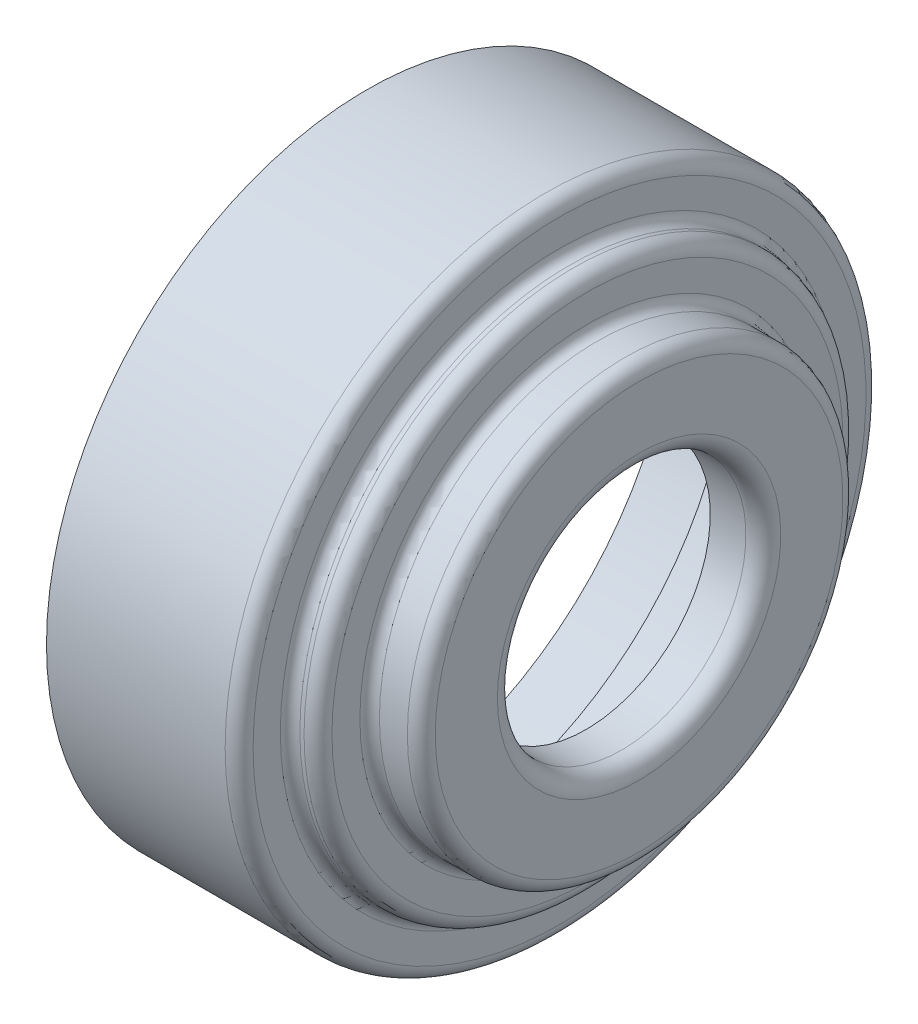
ISO-10303-21;
HEADER;
FILE_DESCRIPTION(('STEP AP214'),'2;1');
FILE_NAME('part.step','',(''),(''),'','','');
FILE_SCHEMA(('AUTOMOTIVE_DESIGN { 1 0 10303 214 1 1 1 1 }'));
ENDSEC;
DATA;
#1=APPLICATION_CONTEXT('core data for automotive mechanical design processes');
#2=APPLICATION_PROTOCOL_DEFINITION('international standard','automotive_design',2000,#1);
#3=PRODUCT_CONTEXT('',#1,'mechanical');
#4=PRODUCT('Part','Part','',(#3));
#5=PRODUCT_RELATED_PRODUCT_CATEGORY('part','',(#4));
#6=PRODUCT_DEFINITION_FORMATION('','',#4);
#7=PRODUCT_DEFINITION_CONTEXT('part definition',#1,'design');
#8=PRODUCT_DEFINITION('design','',#6,#7);
#9=PRODUCT_DEFINITION_SHAPE('','',#8);
#10=(LENGTH_UNIT() NAMED_UNIT(*) SI_UNIT(.MILLI.,.METRE.));
#11=(NAMED_UNIT(*) PLANE_ANGLE_UNIT() SI_UNIT($,.RADIAN.));
#12=(NAMED_UNIT(*) SI_UNIT($,.STERADIAN.) SOLID_ANGLE_UNIT());
#13=UNCERTAINTY_MEASURE_WITH_UNIT(LENGTH_MEASURE(1.E-05),#10,'distance_accuracy_value','');
#14=(GEOMETRIC_REPRESENTATION_CONTEXT(3) GLOBAL_UNCERTAINTY_ASSIGNED_CONTEXT((#13)) GLOBAL_UNIT_ASSIGNED_CONTEXT((#10,
#11,#12)) REPRESENTATION_CONTEXT('',''));
#15=CARTESIAN_POINT('',(0.,0.,0.));
#16=DIRECTION('',(0.,0.,1.));
#17=DIRECTION('',(1.,0.,0.));
#18=AXIS2_PLACEMENT_3D('',#15,#16,#17);
#19=CARTESIAN_POINT('',(0.,21.15,0.));
#20=DIRECTION('',(1.,0.,0.));
#21=DIRECTION('',(0.,0.,-1.));
#22=AXIS2_PLACEMENT_3D('',#19,#20,#21);
#23=PLANE('',#22);
#24=CARTESIAN_POINT('',(0.,0.,0.));
#25=DIRECTION('',(1.,0.,0.));
#26=DIRECTION('',(0.,0.,-1.));
#27=AXIS2_PLACEMENT_3D('',#24,#25,#26);
#28=CIRCLE('',#27,18.);
#29=CARTESIAN_POINT('',(0.,0.,-18.));
#30=VERTEX_POINT('',#29);
#31=EDGE_CURVE('E10',#30,#30,#28,.T.);
#32=ORIENTED_EDGE('',*,*,#31,.T.);
#33=EDGE_LOOP('',(#32));
#34=FACE_BOUND('',#33,.T.);
#35=CARTESIAN_POINT('',(0.,0.,0.));
#36=DIRECTION('',(1.,0.,0.));
#37=DIRECTION('',(0.,0.,-1.));
#38=AXIS2_PLACEMENT_3D('',#35,#36,#37);
#39=CIRCLE('',#38,20.55);
#40=CARTESIAN_POINT('',(0.,0.,-20.55));
#41=VERTEX_POINT('',#40);
#42=EDGE_CURVE('E58',#41,#41,#39,.F.);
#43=ORIENTED_EDGE('',*,*,#42,.T.);
#44=EDGE_LOOP('',(#43));
#45=FACE_BOUND('',#44,.T.);
#46=ADVANCED_FACE('F35',(#34,#45),#23,.F.);
#47=CARTESIAN_POINT('',(-35.4341614906832,0.,0.));
#48=DIRECTION('',(-1.,0.,0.));
#49=DIRECTION('',(0.,0.,1.));
#50=AXIS2_PLACEMENT_3D('',#47,#48,#49);
#51=CYLINDRICAL_SURFACE('',#50,17.8);
#52=CARTESIAN_POINT('',(0.200000000000006,0.,0.));
#53=DIRECTION('',(1.,0.,0.));
#54=DIRECTION('',(0.,0.,-1.));
#55=AXIS2_PLACEMENT_3D('',#52,#53,#54);
#56=CIRCLE('',#55,17.8);
#57=CARTESIAN_POINT('',(0.200000000000006,0.,-17.8));
#58=VERTEX_POINT('',#57);
#59=EDGE_CURVE('E42',#58,#58,#56,.F.);
#60=ORIENTED_EDGE('',*,*,#59,.T.);
#61=EDGE_LOOP('',(#60));
#62=FACE_BOUND('',#61,.T.);
#63=CARTESIAN_POINT('',(1.40000000000001,0.,0.));
#64=DIRECTION('',(1.,0.,0.));
#65=DIRECTION('',(0.,0.,-1.));
#66=AXIS2_PLACEMENT_3D('',#63,#64,#65);
#67=CIRCLE('',#66,17.8);
#68=CARTESIAN_POINT('',(1.40000000000001,0.,-17.8));
#69=VERTEX_POINT('',#68);
#70=EDGE_CURVE('E61',#69,#69,#67,.T.);
#71=ORIENTED_EDGE('',*,*,#70,.T.);
#72=EDGE_LOOP('',(#71));
#73=FACE_BOUND('',#72,.T.);
#74=ADVANCED_FACE('F166',(#62,#73),#51,.F.);
#75=CARTESIAN_POINT('',(2.,17.8,0.));
#76=DIRECTION('',(1.,0.,0.));
#77=DIRECTION('',(0.,0.,-1.));
#78=AXIS2_PLACEMENT_3D('',#75,#76,#77);
#79=PLANE('',#78);
#80=CARTESIAN_POINT('',(2.,0.,0.));
#81=DIRECTION('',(1.,0.,0.));
#82=DIRECTION('',(0.,0.,-1.));
#83=AXIS2_PLACEMENT_3D('',#80,#81,#82);
#84=CIRCLE('',#83,15.6);
#85=CARTESIAN_POINT('',(2.,0.,-15.6));
#86=VERTEX_POINT('',#85);
#87=EDGE_CURVE('E46',#86,#86,#84,.T.);
#88=ORIENTED_EDGE('',*,*,#87,.T.);
#89=EDGE_LOOP('',(#88));
#90=FACE_BOUND('',#89,.T.);
#91=CARTESIAN_POINT('',(2.,0.,0.));
#92=DIRECTION('',(1.,0.,0.));
#93=DIRECTION('',(0.,0.,-1.));
#94=AXIS2_PLACEMENT_3D('',#91,#92,#93);
#95=CIRCLE('',#94,17.2);
#96=CARTESIAN_POINT('',(2.,0.,-17.2));
#97=VERTEX_POINT('',#96);
#98=EDGE_CURVE('E64',#97,#97,#95,.F.);
#99=ORIENTED_EDGE('',*,*,#98,.T.);
#100=EDGE_LOOP('',(#99));
#101=FACE_BOUND('',#100,.T.);
#102=ADVANCED_FACE('F171',(#90,#101),#79,.F.);
#103=CARTESIAN_POINT('',(-35.4341614906832,0.,0.));
#104=DIRECTION('',(-1.,0.,0.));
#105=DIRECTION('',(0.,0.,1.));
#106=AXIS2_PLACEMENT_3D('',#103,#104,#105);
#107=CYLINDRICAL_SURFACE('',#106,13.6);
#108=CARTESIAN_POINT('',(4.,0.,0.));
#109=DIRECTION('',(1.,0.,0.));
#110=DIRECTION('',(0.,0.,-1.));
#111=AXIS2_PLACEMENT_3D('',#108,#109,#110);
#112=CIRCLE('',#111,13.6);
#113=CARTESIAN_POINT('',(4.,0.,-13.6));
#114=VERTEX_POINT('',#113);
#115=EDGE_CURVE('E50',#114,#114,#112,.F.);
#116=ORIENTED_EDGE('',*,*,#115,.T.);
#117=EDGE_LOOP('',(#116));
#118=FACE_BOUND('',#117,.T.);
#119=CARTESIAN_POINT('',(5.50000000000001,0.,0.));
#120=DIRECTION('',(1.,0.,0.));
#121=DIRECTION('',(0.,0.,-1.));
#122=AXIS2_PLACEMENT_3D('',#119,#120,#121);
#123=CIRCLE('',#122,13.6);
#124=CARTESIAN_POINT('',(5.50000000000001,0.,-13.6));
#125=VERTEX_POINT('',#124);
#126=EDGE_CURVE('E67',#125,#125,#123,.T.);
#127=ORIENTED_EDGE('',*,*,#126,.T.);
#128=EDGE_LOOP('',(#127));
#129=FACE_BOUND('',#128,.T.);
#130=ADVANCED_FACE('F226',(#118,#129),#107,.F.);
#131=CARTESIAN_POINT('',(5.7,13.6,0.));
#132=DIRECTION('',(1.,0.,0.));
#133=DIRECTION('',(0.,0.,-1.));
#134=AXIS2_PLACEMENT_3D('',#131,#132,#133);
#135=PLANE('',#134);
#136=CARTESIAN_POINT('',(5.7,0.,0.));
#137=DIRECTION('',(1.,0.,0.));
#138=DIRECTION('',(0.,0.,-1.));
#139=AXIS2_PLACEMENT_3D('',#136,#137,#138);
#140=CIRCLE('',#139,13.4);
#141=CARTESIAN_POINT('',(5.7,0.,-13.4));
#142=VERTEX_POINT('',#141);
#143=EDGE_CURVE('E70',#142,#142,#140,.F.);
#144=ORIENTED_EDGE('',*,*,#143,.T.);
#145=EDGE_LOOP('',(#144));
#146=FACE_BOUND('',#145,.T.);
#147=CARTESIAN_POINT('',(5.7,0.,0.));
#148=DIRECTION('',(1.,0.,0.));
#149=DIRECTION('',(0.,0.,-1.));
#150=AXIS2_PLACEMENT_3D('',#147,#148,#149);
#151=CIRCLE('',#150,9.95);
#152=CARTESIAN_POINT('',(5.7,0.,-9.95));
#153=VERTEX_POINT('',#152);
#154=EDGE_CURVE('E73',#153,#153,#151,.T.);
#155=ORIENTED_EDGE('',*,*,#154,.T.);
#156=EDGE_LOOP('',(#155));
#157=FACE_BOUND('',#156,.T.);
#158=ADVANCED_FACE('F229',(#146,#157),#135,.F.);
#159=CARTESIAN_POINT('',(-35.4341614906832,0.,0.));
#160=DIRECTION('',(-1.,0.,0.));
#161=DIRECTION('',(0.,0.,1.));
#162=AXIS2_PLACEMENT_3D('',#159,#160,#161);
#163=CYLINDRICAL_SURFACE('',#162,9.55);
#164=CARTESIAN_POINT('',(5.30000000000001,0.,0.));
#165=DIRECTION('',(1.,0.,0.));
#166=DIRECTION('',(0.,0.,-1.));
#167=AXIS2_PLACEMENT_3D('',#164,#165,#166);
#168=CIRCLE('',#167,9.55);
#169=CARTESIAN_POINT('',(5.30000000000001,0.,-9.55));
#170=VERTEX_POINT('',#169);
#171=EDGE_CURVE('E76',#170,#170,#168,.F.);
#172=ORIENTED_EDGE('',*,*,#171,.T.);
#173=EDGE_LOOP('',(#172));
#174=FACE_BOUND('',#173,.T.);
#175=CARTESIAN_POINT('',(3.7,0.,0.));
#176=DIRECTION('',(-1.,0.,0.));
#177=DIRECTION('',(0.,0.,1.));
#178=AXIS2_PLACEMENT_3D('',#175,#176,#177);
#179=CIRCLE('',#178,9.55);
#180=CARTESIAN_POINT('',(3.7,0.,9.55));
#181=VERTEX_POINT('',#180);
#182=EDGE_CURVE('E115',#181,#181,#179,.T.);
#183=ORIENTED_EDGE('',*,*,#182,.F.);
#184=EDGE_LOOP('',(#183));
#185=FACE_BOUND('',#184,.T.);
#186=ADVANCED_FACE('F237',(#174,#185),#163,.T.);
#187=CARTESIAN_POINT('',(3.70000000000001,8.9,0.));
#188=DIRECTION('',(1.,0.,0.));
#189=DIRECTION('',(0.,0.,-1.));
#190=AXIS2_PLACEMENT_3D('',#187,#188,#189);
#191=PLANE('',#190);
#192=CARTESIAN_POINT('',(3.7,0.,0.));
#193=DIRECTION('',(-1.,0.,0.));
#194=DIRECTION('',(0.,0.,1.));
#195=AXIS2_PLACEMENT_3D('',#192,#193,#194);
#196=CIRCLE('',#195,8.9);
#197=CARTESIAN_POINT('',(3.7,0.,8.9));
#198=VERTEX_POINT('',#197);
#199=EDGE_CURVE('E118',#198,#198,#196,.T.);
#200=ORIENTED_EDGE('',*,*,#199,.F.);
#201=EDGE_LOOP('',(#200));
#202=FACE_BOUND('',#201,.T.);
#203=ORIENTED_EDGE('',*,*,#182,.T.);
#204=EDGE_LOOP('',(#203));
#205=FACE_BOUND('',#204,.T.);
#206=ADVANCED_FACE('F245',(#202,#205),#191,.F.);
#207=CARTESIAN_POINT('',(-35.4341614906832,0.,0.));
#208=DIRECTION('',(-1.,0.,0.));
#209=DIRECTION('',(0.,0.,1.));
#210=AXIS2_PLACEMENT_3D('',#207,#208,#209);
#211=CYLINDRICAL_SURFACE('',#210,8.9);
#212=CARTESIAN_POINT('',(6.25000000000001,0.,0.));
#213=DIRECTION('',(-1.,0.,0.));
#214=DIRECTION('',(0.,0.,1.));
#215=AXIS2_PLACEMENT_3D('',#212,#213,#214);
#216=CIRCLE('',#215,8.9);
#217=CARTESIAN_POINT('',(6.25000000000001,0.,8.9));
#218=VERTEX_POINT('',#217);
#219=EDGE_CURVE('E109',#218,#218,#216,.F.);
#220=ORIENTED_EDGE('',*,*,#219,.T.);
#221=EDGE_LOOP('',(#220));
#222=FACE_BOUND('',#221,.T.);
#223=ORIENTED_EDGE('',*,*,#199,.T.);
#224=EDGE_LOOP('',(#223));
#225=FACE_BOUND('',#224,.T.);
#226=ADVANCED_FACE('F250',(#222,#225),#211,.F.);
#227=CARTESIAN_POINT('',(7.50000000000001,15.6,0.));
#228=DIRECTION('',(-1.,0.,0.));
#229=DIRECTION('',(0.,0.,1.));
#230=AXIS2_PLACEMENT_3D('',#227,#228,#229);
#231=PLANE('',#230);
#232=CARTESIAN_POINT('',(7.50000000000001,0.,0.));
#233=DIRECTION('',(-1.,0.,0.));
#234=DIRECTION('',(0.,0.,1.));
#235=AXIS2_PLACEMENT_3D('',#232,#233,#234);
#236=CIRCLE('',#235,14.6);
#237=CARTESIAN_POINT('',(7.50000000000001,0.,14.6));
#238=VERTEX_POINT('',#237);
#239=EDGE_CURVE('E97',#238,#238,#236,.F.);
#240=ORIENTED_EDGE('',*,*,#239,.T.);
#241=EDGE_LOOP('',(#240));
#242=FACE_BOUND('',#241,.T.);
#243=CARTESIAN_POINT('',(7.50000000000001,0.,0.));
#244=DIRECTION('',(-1.,0.,0.));
#245=DIRECTION('',(0.,0.,1.));
#246=AXIS2_PLACEMENT_3D('',#243,#244,#245);
#247=CIRCLE('',#246,10.15);
#248=CARTESIAN_POINT('',(7.50000000000001,0.,10.15));
#249=VERTEX_POINT('',#248);
#250=EDGE_CURVE('E112',#249,#249,#247,.T.);
#251=ORIENTED_EDGE('',*,*,#250,.T.);
#252=EDGE_LOOP('',(#251));
#253=FACE_BOUND('',#252,.T.);
#254=ADVANCED_FACE('F256',(#242,#253),#231,.F.);
#255=CARTESIAN_POINT('',(-35.4341614906832,0.,0.));
#256=DIRECTION('',(-1.,0.,0.));
#257=DIRECTION('',(0.,0.,1.));
#258=AXIS2_PLACEMENT_3D('',#255,#256,#257);
#259=CYLINDRICAL_SURFACE('',#258,15.6);
#260=CARTESIAN_POINT('',(4.5,0.,0.));
#261=DIRECTION('',(-1.,0.,0.));
#262=DIRECTION('',(0.,0.,1.));
#263=AXIS2_PLACEMENT_3D('',#260,#261,#262);
#264=CIRCLE('',#263,15.6);
#265=CARTESIAN_POINT('',(4.5,0.,15.6));
#266=VERTEX_POINT('',#265);
#267=EDGE_CURVE('E79',#266,#266,#264,.F.);
#268=ORIENTED_EDGE('',*,*,#267,.T.);
#269=EDGE_LOOP('',(#268));
#270=FACE_BOUND('',#269,.T.);
#271=CARTESIAN_POINT('',(6.50000000000001,0.,0.));
#272=DIRECTION('',(-1.,0.,0.));
#273=DIRECTION('',(0.,0.,1.));
#274=AXIS2_PLACEMENT_3D('',#271,#272,#273);
#275=CIRCLE('',#274,15.6);
#276=CARTESIAN_POINT('',(6.50000000000001,0.,15.6));
#277=VERTEX_POINT('',#276);
#278=EDGE_CURVE('E100',#277,#277,#275,.T.);
#279=ORIENTED_EDGE('',*,*,#278,.T.);
#280=EDGE_LOOP('',(#279));
#281=FACE_BOUND('',#280,.T.);
#282=ADVANCED_FACE('F397',(#270,#281),#259,.T.);
#283=CARTESIAN_POINT('',(3.8,19.3,0.));
#284=DIRECTION('',(-1.,0.,0.));
#285=DIRECTION('',(0.,0.,1.));
#286=AXIS2_PLACEMENT_3D('',#283,#284,#285);
#287=PLANE('',#286);
#288=CARTESIAN_POINT('',(3.8,0.,0.));
#289=DIRECTION('',(-1.,0.,0.));
#290=DIRECTION('',(0.,0.,1.));
#291=AXIS2_PLACEMENT_3D('',#288,#289,#290);
#292=CIRCLE('',#291,16.3);
#293=CARTESIAN_POINT('',(3.8,0.,16.3));
#294=VERTEX_POINT('',#293);
#295=EDGE_CURVE('E82',#294,#294,#292,.T.);
#296=ORIENTED_EDGE('',*,*,#295,.T.);
#297=EDGE_LOOP('',(#296));
#298=FACE_BOUND('',#297,.T.);
#299=CARTESIAN_POINT('',(3.8,0.,0.));
#300=DIRECTION('',(-1.,0.,0.));
#301=DIRECTION('',(0.,0.,1.));
#302=AXIS2_PLACEMENT_3D('',#299,#300,#301);
#303=CIRCLE('',#302,18.3);
#304=CARTESIAN_POINT('',(3.8,0.,18.3));
#305=VERTEX_POINT('',#304);
#306=EDGE_CURVE('E91',#305,#305,#303,.F.);
#307=ORIENTED_EDGE('',*,*,#306,.T.);
#308=EDGE_LOOP('',(#307));
#309=FACE_BOUND('',#308,.T.);
#310=ADVANCED_FACE('F388',(#298,#309),#287,.F.);
#311=CARTESIAN_POINT('',(-35.4341614906832,0.,0.));
#312=DIRECTION('',(-1.,0.,0.));
#313=DIRECTION('',(0.,0.,1.));
#314=AXIS2_PLACEMENT_3D('',#311,#312,#313);
#315=CYLINDRICAL_SURFACE('',#314,19.3);
#316=CARTESIAN_POINT('',(2.5,0.,0.));
#317=DIRECTION('',(-1.,0.,0.));
#318=DIRECTION('',(0.,0.,1.));
#319=AXIS2_PLACEMENT_3D('',#316,#317,#318);
#320=CIRCLE('',#319,19.3);
#321=CARTESIAN_POINT('',(2.5,0.,19.3));
#322=VERTEX_POINT('',#321);
#323=EDGE_CURVE('E85',#322,#322,#320,.F.);
#324=ORIENTED_EDGE('',*,*,#323,.T.);
#325=EDGE_LOOP('',(#324));
#326=FACE_BOUND('',#325,.T.);
#327=CARTESIAN_POINT('',(2.8,0.,0.));
#328=DIRECTION('',(-1.,0.,0.));
#329=DIRECTION('',(0.,0.,1.));
#330=AXIS2_PLACEMENT_3D('',#327,#328,#329);
#331=CIRCLE('',#330,19.3);
#332=CARTESIAN_POINT('',(2.8,0.,19.3));
#333=VERTEX_POINT('',#332);
#334=EDGE_CURVE('E94',#333,#333,#331,.T.);
#335=ORIENTED_EDGE('',*,*,#334,.T.);
#336=EDGE_LOOP('',(#335));
#337=FACE_BOUND('',#336,.T.);
#338=ADVANCED_FACE('F162',(#326,#337),#315,.T.);
#339=CARTESIAN_POINT('',(1.8,22.95,0.));
#340=DIRECTION('',(-1.,0.,0.));
#341=DIRECTION('',(0.,0.,1.));
#342=AXIS2_PLACEMENT_3D('',#339,#340,#341);
#343=PLANE('',#342);
#344=CARTESIAN_POINT('',(1.8,0.,0.));
#345=DIRECTION('',(-1.,0.,0.));
#346=DIRECTION('',(0.,0.,1.));
#347=AXIS2_PLACEMENT_3D('',#344,#345,#346);
#348=CIRCLE('',#347,20.);
#349=CARTESIAN_POINT('',(1.8,0.,20.));
#350=VERTEX_POINT('',#349);
#351=EDGE_CURVE('E88',#350,#350,#348,.T.);
#352=ORIENTED_EDGE('',*,*,#351,.T.);
#353=EDGE_LOOP('',(#352));
#354=FACE_BOUND('',#353,.T.);
#355=CARTESIAN_POINT('',(1.8,0.,0.));
#356=DIRECTION('',(-1.,0.,0.));
#357=DIRECTION('',(0.,0.,1.));
#358=AXIS2_PLACEMENT_3D('',#355,#356,#357);
#359=CIRCLE('',#358,21.95);
#360=CARTESIAN_POINT('',(1.8,0.,21.95));
#361=VERTEX_POINT('',#360);
#362=EDGE_CURVE('E103',#361,#361,#359,.F.);
#363=ORIENTED_EDGE('',*,*,#362,.T.);
#364=EDGE_LOOP('',(#363));
#365=FACE_BOUND('',#364,.T.);
#366=ADVANCED_FACE('F156',(#354,#365),#343,.F.);
#367=CARTESIAN_POINT('',(-35.4341614906832,0.,0.));
#368=DIRECTION('',(-1.,0.,0.));
#369=DIRECTION('',(0.,0.,1.));
#370=AXIS2_PLACEMENT_3D('',#367,#368,#369);
#371=CYLINDRICAL_SURFACE('',#370,22.95);
#372=CARTESIAN_POINT('',(0.800000000000002,0.,0.));
#373=DIRECTION('',(-1.,0.,0.));
#374=DIRECTION('',(0.,0.,1.));
#375=AXIS2_PLACEMENT_3D('',#372,#373,#374);
#376=CIRCLE('',#375,22.95);
#377=CARTESIAN_POINT('',(0.800000000000002,0.,22.95));
#378=VERTEX_POINT('',#377);
#379=EDGE_CURVE('E106',#378,#378,#376,.T.);
#380=ORIENTED_EDGE('',*,*,#379,.T.);
#381=EDGE_LOOP('',(#380));
#382=FACE_BOUND('',#381,.T.);
#383=CARTESIAN_POINT('',(-12.,0.,0.));
#384=DIRECTION('',(-1.,0.,0.));
#385=DIRECTION('',(0.,0.,1.));
#386=AXIS2_PLACEMENT_3D('',#383,#384,#385);
#387=CIRCLE('',#386,22.95);
#388=CARTESIAN_POINT('',(-12.,0.,22.95));
#389=VERTEX_POINT('',#388);
#390=EDGE_CURVE('E121',#389,#389,#387,.T.);
#391=ORIENTED_EDGE('',*,*,#390,.F.);
#392=EDGE_LOOP('',(#391));
#393=FACE_BOUND('',#392,.T.);
#394=ADVANCED_FACE('F151',(#382,#393),#371,.T.);
#395=CARTESIAN_POINT('',(-12.,22.15,0.));
#396=DIRECTION('',(1.,0.,0.));
#397=DIRECTION('',(0.,0.,-1.));
#398=AXIS2_PLACEMENT_3D('',#395,#396,#397);
#399=PLANE('',#398);
#400=CARTESIAN_POINT('',(-12.,0.,0.));
#401=DIRECTION('',(-1.,0.,0.));
#402=DIRECTION('',(0.,0.,1.));
#403=AXIS2_PLACEMENT_3D('',#400,#401,#402);
#404=CIRCLE('',#403,22.15);
#405=CARTESIAN_POINT('',(-12.,0.,22.15));
#406=VERTEX_POINT('',#405);
#407=EDGE_CURVE('E124',#406,#406,#404,.T.);
#408=ORIENTED_EDGE('',*,*,#407,.F.);
#409=EDGE_LOOP('',(#408));
#410=FACE_BOUND('',#409,.T.);
#411=ORIENTED_EDGE('',*,*,#390,.T.);
#412=EDGE_LOOP('',(#411));
#413=FACE_BOUND('',#412,.T.);
#414=ADVANCED_FACE('F145',(#410,#413),#399,.F.);
#415=CARTESIAN_POINT('',(-35.4341614906832,0.,0.));
#416=DIRECTION('',(-1.,0.,0.));
#417=DIRECTION('',(0.,0.,1.));
#418=AXIS2_PLACEMENT_3D('',#415,#416,#417);
#419=CYLINDRICAL_SURFACE('',#418,22.15);
#420=CARTESIAN_POINT('',(-7.,0.,0.));
#421=DIRECTION('',(-1.,0.,0.));
#422=DIRECTION('',(0.,0.,1.));
#423=AXIS2_PLACEMENT_3D('',#420,#421,#422);
#424=CIRCLE('',#423,22.15);
#425=CARTESIAN_POINT('',(-7.,0.,22.15));
#426=VERTEX_POINT('',#425);
#427=EDGE_CURVE('E127',#426,#426,#424,.T.);
#428=ORIENTED_EDGE('',*,*,#427,.F.);
#429=EDGE_LOOP('',(#428));
#430=FACE_BOUND('',#429,.T.);
#431=ORIENTED_EDGE('',*,*,#407,.T.);
#432=EDGE_LOOP('',(#431));
#433=FACE_BOUND('',#432,.T.);
#434=ADVANCED_FACE('F139',(#430,#433),#419,.F.);
#435=CARTESIAN_POINT('',(-7.,22.15,0.));
#436=DIRECTION('',(1.,0.,0.));
#437=DIRECTION('',(0.,0.,-1.));
#438=AXIS2_PLACEMENT_3D('',#435,#436,#437);
#439=PLANE('',#438);
#440=CARTESIAN_POINT('',(-7.,0.,0.));
#441=DIRECTION('',(-1.,0.,0.));
#442=DIRECTION('',(0.,0.,1.));
#443=AXIS2_PLACEMENT_3D('',#440,#441,#442);
#444=CIRCLE('',#443,21.15);
#445=CARTESIAN_POINT('',(-7.,0.,21.15));
#446=VERTEX_POINT('',#445);
#447=EDGE_CURVE('E130',#446,#446,#444,.T.);
#448=ORIENTED_EDGE('',*,*,#447,.F.);
#449=EDGE_LOOP('',(#448));
#450=FACE_BOUND('',#449,.T.);
#451=ORIENTED_EDGE('',*,*,#427,.T.);
#452=EDGE_LOOP('',(#451));
#453=FACE_BOUND('',#452,.T.);
#454=ADVANCED_FACE('F136',(#450,#453),#439,.F.);
#455=CARTESIAN_POINT('',(-35.4341614906832,0.,0.));
#456=DIRECTION('',(-1.,0.,0.));
#457=DIRECTION('',(0.,0.,1.));
#458=AXIS2_PLACEMENT_3D('',#455,#456,#457);
#459=CYLINDRICAL_SURFACE('',#458,21.15);
#460=CARTESIAN_POINT('',(-0.599999999999996,0.,0.));
#461=DIRECTION('',(1.,0.,0.));
#462=DIRECTION('',(0.,0.,-1.));
#463=AXIS2_PLACEMENT_3D('',#460,#461,#462);
#464=CIRCLE('',#463,21.15);
#465=CARTESIAN_POINT('',(-0.599999999999996,0.,-21.15));
#466=VERTEX_POINT('',#465);
#467=EDGE_CURVE('E55',#466,#466,#464,.T.);
#468=ORIENTED_EDGE('',*,*,#467,.T.);
#469=EDGE_LOOP('',(#468));
#470=FACE_BOUND('',#469,.T.);
#471=ORIENTED_EDGE('',*,*,#447,.T.);
#472=EDGE_LOOP('',(#471));
#473=FACE_BOUND('',#472,.T.);
#474=ADVANCED_FACE('F134',(#470,#473),#459,.F.);
#475=CARTESIAN_POINT('',(6.25000000000001,0.,0.));
#476=DIRECTION('',(-1.,0.,0.));
#477=DIRECTION('',(0.,0.,1.));
#478=AXIS2_PLACEMENT_3D('',#475,#476,#477);
#479=TOROIDAL_SURFACE('',#478,10.15,1.25);
#480=ORIENTED_EDGE('',*,*,#219,.F.);
#481=EDGE_LOOP('',(#480));
#482=FACE_BOUND('',#481,.T.);
#483=ORIENTED_EDGE('',*,*,#250,.F.);
#484=EDGE_LOOP('',(#483));
#485=FACE_BOUND('',#484,.T.);
#486=ADVANCED_FACE('F176',(#482,#485),#479,.T.);
#487=CARTESIAN_POINT('',(0.800000000000002,0.,0.));
#488=DIRECTION('',(-1.,0.,0.));
#489=DIRECTION('',(0.,0.,1.));
#490=AXIS2_PLACEMENT_3D('',#487,#488,#489);
#491=TOROIDAL_SURFACE('',#490,21.95,1.);
#492=ORIENTED_EDGE('',*,*,#362,.F.);
#493=EDGE_LOOP('',(#492));
#494=FACE_BOUND('',#493,.T.);
#495=ORIENTED_EDGE('',*,*,#379,.F.);
#496=EDGE_LOOP('',(#495));
#497=FACE_BOUND('',#496,.T.);
#498=ADVANCED_FACE('F179',(#494,#497),#491,.T.);
#499=CARTESIAN_POINT('',(6.50000000000001,0.,0.));
#500=DIRECTION('',(-1.,0.,0.));
#501=DIRECTION('',(0.,0.,1.));
#502=AXIS2_PLACEMENT_3D('',#499,#500,#501);
#503=TOROIDAL_SURFACE('',#502,14.6,1.);
#504=ORIENTED_EDGE('',*,*,#239,.F.);
#505=EDGE_LOOP('',(#504));
#506=FACE_BOUND('',#505,.T.);
#507=ORIENTED_EDGE('',*,*,#278,.F.);
#508=EDGE_LOOP('',(#507));
#509=FACE_BOUND('',#508,.T.);
#510=ADVANCED_FACE('F183',(#506,#509),#503,.T.);
#511=CARTESIAN_POINT('',(2.8,0.,0.));
#512=DIRECTION('',(-1.,0.,0.));
#513=DIRECTION('',(0.,0.,1.));
#514=AXIS2_PLACEMENT_3D('',#511,#512,#513);
#515=TOROIDAL_SURFACE('',#514,18.3,1.);
#516=ORIENTED_EDGE('',*,*,#306,.F.);
#517=EDGE_LOOP('',(#516));
#518=FACE_BOUND('',#517,.T.);
#519=ORIENTED_EDGE('',*,*,#334,.F.);
#520=EDGE_LOOP('',(#519));
#521=FACE_BOUND('',#520,.T.);
#522=ADVANCED_FACE('F187',(#518,#521),#515,.T.);
#523=CARTESIAN_POINT('',(2.5,0.,0.));
#524=DIRECTION('',(-1.,0.,0.));
#525=DIRECTION('',(0.,0.,1.));
#526=AXIS2_PLACEMENT_3D('',#523,#524,#525);
#527=TOROIDAL_SURFACE('',#526,20.,0.7);
#528=ORIENTED_EDGE('',*,*,#323,.F.);
#529=EDGE_LOOP('',(#528));
#530=FACE_BOUND('',#529,.T.);
#531=ORIENTED_EDGE('',*,*,#351,.F.);
#532=EDGE_LOOP('',(#531));
#533=FACE_BOUND('',#532,.T.);
#534=ADVANCED_FACE('F191',(#530,#533),#527,.F.);
#535=CARTESIAN_POINT('',(4.5,0.,0.));
#536=DIRECTION('',(-1.,0.,0.));
#537=DIRECTION('',(0.,0.,1.));
#538=AXIS2_PLACEMENT_3D('',#535,#536,#537);
#539=TOROIDAL_SURFACE('',#538,16.3,0.7);
#540=ORIENTED_EDGE('',*,*,#267,.F.);
#541=EDGE_LOOP('',(#540));
#542=FACE_BOUND('',#541,.T.);
#543=ORIENTED_EDGE('',*,*,#295,.F.);
#544=EDGE_LOOP('',(#543));
#545=FACE_BOUND('',#544,.T.);
#546=ADVANCED_FACE('F195',(#542,#545),#539,.F.);
#547=CARTESIAN_POINT('',(5.30000000000001,0.,0.));
#548=DIRECTION('',(1.,0.,0.));
#549=DIRECTION('',(0.,0.,-1.));
#550=AXIS2_PLACEMENT_3D('',#547,#548,#549);
#551=TOROIDAL_SURFACE('',#550,9.95,0.4);
#552=ORIENTED_EDGE('',*,*,#154,.F.);
#553=EDGE_LOOP('',(#552));
#554=FACE_BOUND('',#553,.T.);
#555=ORIENTED_EDGE('',*,*,#171,.F.);
#556=EDGE_LOOP('',(#555));
#557=FACE_BOUND('',#556,.T.);
#558=ADVANCED_FACE('F199',(#554,#557),#551,.F.);
#559=CARTESIAN_POINT('',(5.50000000000001,0.,0.));
#560=DIRECTION('',(1.,0.,0.));
#561=DIRECTION('',(0.,0.,-1.));
#562=AXIS2_PLACEMENT_3D('',#559,#560,#561);
#563=TOROIDAL_SURFACE('',#562,13.4,0.2);
#564=ORIENTED_EDGE('',*,*,#126,.F.);
#565=EDGE_LOOP('',(#564));
#566=FACE_BOUND('',#565,.T.);
#567=ORIENTED_EDGE('',*,*,#143,.F.);
#568=EDGE_LOOP('',(#567));
#569=FACE_BOUND('',#568,.T.);
#570=ADVANCED_FACE('F203',(#566,#569),#563,.F.);
#571=CARTESIAN_POINT('',(1.40000000000001,0.,0.));
#572=DIRECTION('',(1.,0.,0.));
#573=DIRECTION('',(0.,0.,-1.));
#574=AXIS2_PLACEMENT_3D('',#571,#572,#573);
#575=TOROIDAL_SURFACE('',#574,17.2,0.6);
#576=ORIENTED_EDGE('',*,*,#70,.F.);
#577=EDGE_LOOP('',(#576));
#578=FACE_BOUND('',#577,.T.);
#579=ORIENTED_EDGE('',*,*,#98,.F.);
#580=EDGE_LOOP('',(#579));
#581=FACE_BOUND('',#580,.T.);
#582=ADVANCED_FACE('F207',(#578,#581),#575,.F.);
#583=CARTESIAN_POINT('',(-0.599999999999996,0.,0.));
#584=DIRECTION('',(1.,0.,0.));
#585=DIRECTION('',(0.,0.,-1.));
#586=AXIS2_PLACEMENT_3D('',#583,#584,#585);
#587=TOROIDAL_SURFACE('',#586,20.55,0.6);
#588=ORIENTED_EDGE('',*,*,#467,.F.);
#589=EDGE_LOOP('',(#588));
#590=FACE_BOUND('',#589,.T.);
#591=ORIENTED_EDGE('',*,*,#42,.F.);
#592=EDGE_LOOP('',(#591));
#593=FACE_BOUND('',#592,.T.);
#594=ADVANCED_FACE('F211',(#590,#593),#587,.F.);
#595=CARTESIAN_POINT('',(4.,0.,0.));
#596=DIRECTION('',(1.,0.,0.));
#597=DIRECTION('',(0.,0.,-1.));
#598=AXIS2_PLACEMENT_3D('',#595,#596,#597);
#599=TOROIDAL_SURFACE('',#598,15.6,2.);
#600=ORIENTED_EDGE('',*,*,#87,.F.);
#601=EDGE_LOOP('',(#600));
#602=FACE_BOUND('',#601,.T.);
#603=ORIENTED_EDGE('',*,*,#115,.F.);
#604=EDGE_LOOP('',(#603));
#605=FACE_BOUND('',#604,.T.);
#606=ADVANCED_FACE('F214',(#602,#605),#599,.T.);
#607=CARTESIAN_POINT('',(0.200000000000006,0.,0.));
#608=DIRECTION('',(1.,0.,0.));
#609=DIRECTION('',(0.,0.,-1.));
#610=AXIS2_PLACEMENT_3D('',#607,#608,#609);
#611=TOROIDAL_SURFACE('',#610,18.,0.2);
#612=ORIENTED_EDGE('',*,*,#31,.F.);
#613=EDGE_LOOP('',(#612));
#614=FACE_BOUND('',#613,.T.);
#615=ORIENTED_EDGE('',*,*,#59,.F.);
#616=EDGE_LOOP('',(#615));
#617=FACE_BOUND('',#616,.T.);
#618=ADVANCED_FACE('F37',(#614,#617),#611,.T.);
#619=CLOSED_SHELL('',(#46,#74,#102,#130,#158,#186,#206,#226,#254,#282,#310,#338,#366,#394,#414,
#434,#454,#474,#486,#498,#510,#522,#534,#546,#558,#570,#582,#594,#606,#618));
#620=MANIFOLD_SOLID_BREP('B2',#619);
#621=ADVANCED_BREP_SHAPE_REPRESENTATION('',(#18,#620),#14);
#622=SHAPE_DEFINITION_REPRESENTATION(#9,#621);
ENDSEC;
END-ISO-10303-21;
